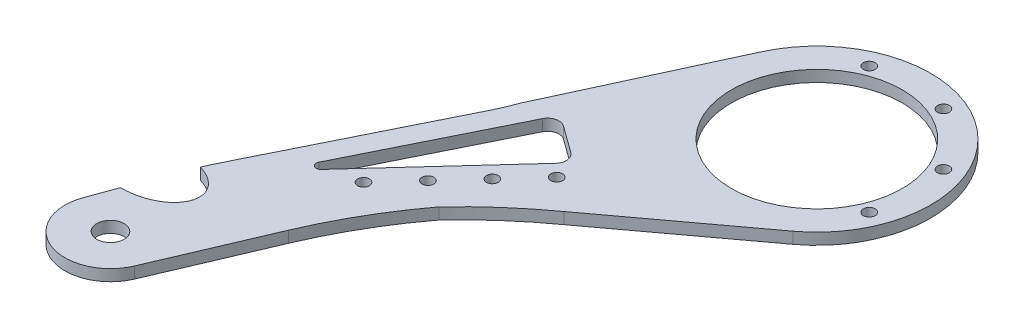
ISO-10303-21;
HEADER;
FILE_DESCRIPTION(('STEP AP214'),'2;1');
FILE_NAME('part.step','',(''),(''),'','','');
FILE_SCHEMA(('AUTOMOTIVE_DESIGN { 1 0 10303 214 1 1 1 1 }'));
ENDSEC;
DATA;
#1=APPLICATION_CONTEXT('core data for automotive mechanical design processes');
#2=APPLICATION_PROTOCOL_DEFINITION('international standard','automotive_design',2000,#1);
#3=PRODUCT_CONTEXT('',#1,'mechanical');
#4=PRODUCT('Part','Part','',(#3));
#5=PRODUCT_RELATED_PRODUCT_CATEGORY('part','',(#4));
#6=PRODUCT_DEFINITION_FORMATION('','',#4);
#7=PRODUCT_DEFINITION_CONTEXT('part definition',#1,'design');
#8=PRODUCT_DEFINITION('design','',#6,#7);
#9=PRODUCT_DEFINITION_SHAPE('','',#8);
#10=(LENGTH_UNIT() NAMED_UNIT(*) SI_UNIT(.MILLI.,.METRE.));
#11=(NAMED_UNIT(*) PLANE_ANGLE_UNIT() SI_UNIT($,.RADIAN.));
#12=(NAMED_UNIT(*) SI_UNIT($,.STERADIAN.) SOLID_ANGLE_UNIT());
#13=UNCERTAINTY_MEASURE_WITH_UNIT(LENGTH_MEASURE(1.E-05),#10,'distance_accuracy_value','');
#14=(GEOMETRIC_REPRESENTATION_CONTEXT(3) GLOBAL_UNCERTAINTY_ASSIGNED_CONTEXT((#13)) GLOBAL_UNIT_ASSIGNED_CONTEXT((#10,
#11,#12)) REPRESENTATION_CONTEXT('',''));
#15=CARTESIAN_POINT('',(0.,0.,0.));
#16=DIRECTION('',(0.,0.,1.));
#17=DIRECTION('',(1.,0.,0.));
#18=AXIS2_PLACEMENT_3D('',#15,#16,#17);
#19=CARTESIAN_POINT('',(-88.7927003386237,5.,81.1322056754742));
#20=DIRECTION('',(0.,1.,0.));
#21=DIRECTION('',(0.,0.,1.));
#22=AXIS2_PLACEMENT_3D('',#19,#20,#21);
#23=PLANE('',#22);
#24=CARTESIAN_POINT('',(27.9615833019237,5.,-116.100257823008));
#25=DIRECTION('',(0.,1.,0.));
#26=DIRECTION('',(0.,0.,1.));
#27=AXIS2_PLACEMENT_3D('',#24,#25,#26);
#28=CIRCLE('',#27,2.59999999999999);
#29=CARTESIAN_POINT('',(27.9615833019237,5.,-113.500257823008));
#30=VERTEX_POINT('',#29);
#31=EDGE_CURVE('E830',#30,#30,#28,.T.);
#32=ORIENTED_EDGE('',*,*,#31,.F.);
#33=EDGE_LOOP('',(#32));
#34=FACE_BOUND('',#33,.T.);
#35=CARTESIAN_POINT('',(83.4905093091692,5.,-60.5713318157631));
#36=DIRECTION('',(0.,1.,0.));
#37=DIRECTION('',(0.,0.,1.));
#38=AXIS2_PLACEMENT_3D('',#35,#36,#37);
#39=CIRCLE('',#38,2.59999999999989);
#40=CARTESIAN_POINT('',(83.4905093091692,5.,-57.9713318157632));
#41=VERTEX_POINT('',#40);
#42=EDGE_CURVE('E836',#41,#41,#39,.T.);
#43=ORIENTED_EDGE('',*,*,#42,.F.);
#44=EDGE_LOOP('',(#43));
#45=FACE_BOUND('',#44,.T.);
#46=CARTESIAN_POINT('',(83.4905093091702,5.,-93.0994235667966));
#47=DIRECTION('',(0.,1.,0.));
#48=DIRECTION('',(0.,0.,1.));
#49=AXIS2_PLACEMENT_3D('',#46,#47,#48);
#50=CIRCLE('',#49,2.60000000000001);
#51=CARTESIAN_POINT('',(83.4905093091702,5.,-90.4994235667966));
#52=VERTEX_POINT('',#51);
#53=EDGE_CURVE('E848',#52,#52,#50,.T.);
#54=ORIENTED_EDGE('',*,*,#53,.F.);
#55=EDGE_LOOP('',(#54));
#56=FACE_BOUND('',#55,.T.);
#57=CARTESIAN_POINT('',(60.4896750529558,5.,-116.100257823009));
#58=DIRECTION('',(0.,1.,0.));
#59=DIRECTION('',(0.,0.,1.));
#60=AXIS2_PLACEMENT_3D('',#57,#58,#59);
#61=CIRCLE('',#60,2.6);
#62=CARTESIAN_POINT('',(60.4896750529558,5.,-113.500257823009));
#63=VERTEX_POINT('',#62);
#64=EDGE_CURVE('E489',#63,#63,#61,.T.);
#65=ORIENTED_EDGE('',*,*,#64,.F.);
#66=EDGE_LOOP('',(#65));
#67=FACE_BOUND('',#66,.T.);
#68=CARTESIAN_POINT('',(-25.3201127019089,5.,24.2247027825062));
#69=DIRECTION('',(0.,1.,0.));
#70=DIRECTION('',(0.,0.,1.));
#71=AXIS2_PLACEMENT_3D('',#68,#69,#70);
#72=CIRCLE('',#71,2.6);
#73=CARTESIAN_POINT('',(-25.3201127019089,5.,26.8247027825062));
#74=VERTEX_POINT('',#73);
#75=EDGE_CURVE('E493',#74,#74,#72,.T.);
#76=ORIENTED_EDGE('',*,*,#75,.F.);
#77=EDGE_LOOP('',(#76));
#78=FACE_BOUND('',#77,.T.);
#79=CARTESIAN_POINT('',(-38.8046537707504,5.,38.9951852445901));
#80=DIRECTION('',(0.,1.,0.));
#81=DIRECTION('',(0.,0.,1.));
#82=AXIS2_PLACEMENT_3D('',#79,#80,#81);
#83=CIRCLE('',#82,2.6);
#84=CARTESIAN_POINT('',(-38.8046537707504,5.,41.5951852445901));
#85=VERTEX_POINT('',#84);
#86=EDGE_CURVE('E505',#85,#85,#83,.T.);
#87=ORIENTED_EDGE('',*,*,#86,.F.);
#88=EDGE_LOOP('',(#87));
#89=FACE_BOUND('',#88,.T.);
#90=CARTESIAN_POINT('',(-75.6532377558085,5.,113.15518022732));
#91=DIRECTION('',(0.,1.,0.));
#92=DIRECTION('',(0.,0.,1.));
#93=AXIS2_PLACEMENT_3D('',#90,#91,#92);
#94=CIRCLE('',#93,6.00000000000002);
#95=CARTESIAN_POINT('',(-75.6532377558085,5.,119.15518022732));
#96=VERTEX_POINT('',#95);
#97=EDGE_CURVE('E211',#96,#96,#94,.T.);
#98=ORIENTED_EDGE('',*,*,#97,.F.);
#99=EDGE_LOOP('',(#98));
#100=FACE_BOUND('',#99,.T.);
#101=CARTESIAN_POINT('',(44.2256291774395,5.,-76.8353776912794));
#102=DIRECTION('',(0.,1.,0.));
#103=DIRECTION('',(0.,0.,1.));
#104=AXIS2_PLACEMENT_3D('',#101,#102,#103);
#105=CIRCLE('',#104,50.);
#106=CARTESIAN_POINT('',(73.9920089972099,5.,-36.6612239052298));
#107=VERTEX_POINT('',#106);
#108=CARTESIAN_POINT('',(-1.18705120751491,5.,-97.7563829313242));
#109=VERTEX_POINT('',#108);
#110=EDGE_CURVE('E241',#107,#109,#105,.T.);
#111=ORIENTED_EDGE('',*,*,#110,.T.);
#112=DIRECTION('',(-0.418420104800895,0.,0.908253607699088));
#113=VECTOR('',#112,1.);
#114=CARTESIAN_POINT('',(-1.18705120751491,5.,-97.7563829313242));
#115=LINE('',#114,#113);
#116=CARTESIAN_POINT('',(-34.3999667324277,5.,-25.6619735050336));
#117=VERTEX_POINT('',#116);
#118=EDGE_CURVE('E245',#109,#117,#115,.T.);
#119=ORIENTED_EDGE('',*,*,#118,.T.);
#120=CARTESIAN_POINT('',(-128.369228811018,5.,-59.863987837601));
#121=DIRECTION('',(0.,-1.,0.));
#122=DIRECTION('',(0.,0.,1.));
#123=AXIS2_PLACEMENT_3D('',#120,#121,#122);
#124=CIRCLE('',#123,100.);
#125=CARTESIAN_POINT('',(-38.7551272658423,5.,-15.487047832111));
#126=VERTEX_POINT('',#125);
#127=EDGE_CURVE('E249',#117,#126,#124,.T.);
#128=ORIENTED_EDGE('',*,*,#127,.T.);
#129=DIRECTION('',(-0.443769400054901,0.,0.896141015451761));
#130=VECTOR('',#129,1.);
#131=CARTESIAN_POINT('',(-38.7551272658423,5.,-15.487047832111));
#132=LINE('',#131,#130);
#133=CARTESIAN_POINT('',(-76.7022391093313,5.,61.1427588573066));
#134=VERTEX_POINT('',#133);
#135=EDGE_CURVE('E252',#126,#134,#132,.T.);
#136=ORIENTED_EDGE('',*,*,#135,.T.);
#137=CARTESIAN_POINT('',(102.525963981021,5.,149.896638868287));
#138=DIRECTION('',(0.,1.,0.));
#139=DIRECTION('',(0.,0.,1.));
#140=AXIS2_PLACEMENT_3D('',#137,#138,#139);
#141=CIRCLE('',#140,200.);
#142=CARTESIAN_POINT('',(-80.375519882012,5.,68.9828130985166));
#143=VERTEX_POINT('',#142);
#144=EDGE_CURVE('E255',#134,#143,#141,.T.);
#145=ORIENTED_EDGE('',*,*,#144,.T.);
#146=CARTESIAN_POINT('',(-88.7927003386237,5.,81.1322056754742));
#147=DIRECTION('',(0.,-1.,0.));
#148=DIRECTION('',(0.998564288915161,0.,-0.0535664158158636));
#149=AXIS2_PLACEMENT_3D('',#146,#147,#148);
#150=ELLIPSE('',#149,19.6254544070607,13.1666159932936);
#151=CARTESIAN_POINT('',(-90.0808788848002,5.,94.3187104419573));
#152=VERTEX_POINT('',#151);
#153=EDGE_CURVE('E258',#143,#152,#150,.T.);
#154=ORIENTED_EDGE('',*,*,#153,.T.);
#155=DIRECTION('',(-0.342020143325669,0.,0.939692620785908));
#156=VECTOR('',#155,1.);
#157=CARTESIAN_POINT('',(-90.0808788848002,5.,94.3187104419573));
#158=LINE('',#157,#156);
#159=CARTESIAN_POINT('',(-94.4470901715267,5.,106.314777360806));
#160=VERTEX_POINT('',#159);
#161=EDGE_CURVE('E262',#152,#160,#158,.T.);
#162=ORIENTED_EDGE('',*,*,#161,.T.);
#163=CARTESIAN_POINT('',(-75.6532377558085,5.,113.15518022732));
#164=DIRECTION('',(0.,1.,0.));
#165=DIRECTION('',(0.,0.,1.));
#166=AXIS2_PLACEMENT_3D('',#163,#164,#165);
#167=CIRCLE('',#166,20.0000000000001);
#168=CARTESIAN_POINT('',(-57.2522995441009,5.,120.991344654444));
#169=VERTEX_POINT('',#168);
#170=EDGE_CURVE('E447',#160,#169,#167,.T.);
#171=ORIENTED_EDGE('',*,*,#170,.T.);
#172=DIRECTION('',(0.391808221356202,0.,-0.920046910585373));
#173=VECTOR('',#172,1.);
#174=CARTESIAN_POINT('',(-57.2522995441009,5.,120.991344654444));
#175=LINE('',#174,#173);
#176=CARTESIAN_POINT('',(-37.0734908065259,5.,73.6073194442618));
#177=VERTEX_POINT('',#176);
#178=EDGE_CURVE('E345',#169,#177,#175,.T.);
#179=ORIENTED_EDGE('',*,*,#178,.T.);
#180=CARTESIAN_POINT('',(146.935891310549,5.,151.968963715502));
#181=DIRECTION('',(0.,-1.,0.));
#182=DIRECTION('',(0.,0.,1.));
#183=AXIS2_PLACEMENT_3D('',#180,#181,#182);
#184=CIRCLE('',#183,200.);
#185=CARTESIAN_POINT('',(-12.947104360705,5.,31.8131161874443));
#186=VERTEX_POINT('',#185);
#187=EDGE_CURVE('E443',#177,#186,#184,.T.);
#188=ORIENTED_EDGE('',*,*,#187,.T.);
#189=CARTESIAN_POINT('',(133.146696692921,5.,168.402285940041));
#190=DIRECTION('',(0.,-1.,0.));
#191=DIRECTION('',(0.,0.,1.));
#192=AXIS2_PLACEMENT_3D('',#189,#190,#191);
#193=CIRCLE('',#192,200.);
#194=CARTESIAN_POINT('',(16.2791838018403,5.,6.10014661140118));
#195=VERTEX_POINT('',#194);
#196=EDGE_CURVE('E440',#186,#195,#193,.T.);
#197=ORIENTED_EDGE('',*,*,#196,.T.);
#198=DIRECTION('',(0.803483075720993,0.,-0.595327596395407));
#199=VECTOR('',#198,1.);
#200=CARTESIAN_POINT('',(16.2791838018403,5.,6.1001466114012));
#201=LINE('',#200,#199);
#202=EDGE_CURVE('E370',#195,#107,#201,.T.);
#203=ORIENTED_EDGE('',*,*,#202,.T.);
#204=EDGE_LOOP('',(#111,#119,#128,#136,#145,#154,#162,#171,#179,#188,#197,#203));
#205=FACE_BOUND('',#204,.T.);
#206=DIRECTION('',(0.674227053442074,0.,-0.738524123104194));
#207=VECTOR('',#206,1.);
#208=CARTESIAN_POINT('',(-52.9804236740807,5.,43.3989658731272));
#209=LINE('',#208,#207);
#210=CARTESIAN_POINT('',(-52.9804236740807,5.,43.3989658731272));
#211=VERTEX_POINT('',#210);
#212=CARTESIAN_POINT('',(-3.88996148750742,5.,-10.3729650424772));
#213=VERTEX_POINT('',#212);
#214=EDGE_CURVE('E178',#211,#213,#209,.T.);
#215=ORIENTED_EDGE('',*,*,#214,.F.);
#216=CARTESIAN_POINT('',(-54.4574719202891,5.,42.0505117662431));
#217=DIRECTION('',(0.,1.,0.));
#218=DIRECTION('',(0.,0.,1.));
#219=AXIS2_PLACEMENT_3D('',#216,#217,#218);
#220=CIRCLE('',#219,2.);
#221=CARTESIAN_POINT('',(-56.2497539511927,5.,41.1629729661333));
#222=VERTEX_POINT('',#221);
#223=EDGE_CURVE('E169',#222,#211,#220,.T.);
#224=ORIENTED_EDGE('',*,*,#223,.F.);
#225=DIRECTION('',(-0.443769400054901,0.,0.896141015451761));
#226=VECTOR('',#225,1.);
#227=CARTESIAN_POINT('',(-23.7609108853903,5.,-24.4444907576818));
#228=LINE('',#227,#226);
#229=CARTESIAN_POINT('',(-23.7609108853902,5.,-24.4444907576818));
#230=VERTEX_POINT('',#229);
#231=EDGE_CURVE('E206',#230,#222,#228,.T.);
#232=ORIENTED_EDGE('',*,*,#231,.F.);
#233=CARTESIAN_POINT('',(-19.2802058081314,5.,-22.2256437574073));
#234=DIRECTION('',(0.,1.,0.));
#235=DIRECTION('',(0.,0.,1.));
#236=AXIS2_PLACEMENT_3D('',#233,#234,#235);
#237=CIRCLE('',#236,5.00000000000001);
#238=CARTESIAN_POINT('',(-16.345194147774,5.,-26.2735699614735));
#239=VERTEX_POINT('',#238);
#240=EDGE_CURVE('E203',#239,#230,#237,.T.);
#241=ORIENTED_EDGE('',*,*,#240,.F.);
#242=DIRECTION('',(-0.809585240813242,0.,-0.587002332071488));
#243=VECTOR('',#242,1.);
#244=CARTESIAN_POINT('',(-4.64757044267095,5.,-17.7920265137537));
#245=LINE('',#244,#243);
#246=CARTESIAN_POINT('',(-4.64757044267095,5.,-17.7920265137537));
#247=VERTEX_POINT('',#246);
#248=EDGE_CURVE('E197',#247,#239,#245,.T.);
#249=ORIENTED_EDGE('',*,*,#248,.F.);
#250=CARTESIAN_POINT('',(-7.58258210302839,5.,-13.7441003096875));
#251=DIRECTION('',(0.,1.,0.));
#252=DIRECTION('',(0.,0.,1.));
#253=AXIS2_PLACEMENT_3D('',#250,#251,#252);
#254=CIRCLE('',#253,5.);
#255=EDGE_CURVE('E193',#213,#247,#254,.T.);
#256=ORIENTED_EDGE('',*,*,#255,.F.);
#257=EDGE_LOOP('',(#215,#224,#232,#241,#249,#256));
#258=FACE_BOUND('',#257,.T.);
#259=CARTESIAN_POINT('',(44.2256291774395,5.,-76.8353776912794));
#260=DIRECTION('',(0.,1.,0.));
#261=DIRECTION('',(0.,0.,1.));
#262=AXIS2_PLACEMENT_3D('',#259,#260,#261);
#263=CIRCLE('',#262,37.5);
#264=CARTESIAN_POINT('',(44.2256291774395,5.,-39.3353776912794));
#265=VERTEX_POINT('',#264);
#266=EDGE_CURVE('E511',#265,#265,#263,.T.);
#267=ORIENTED_EDGE('',*,*,#266,.F.);
#268=EDGE_LOOP('',(#267));
#269=FACE_BOUND('',#268,.T.);
#270=CARTESIAN_POINT('',(-11.8355716330674,5.,9.45422032042229));
#271=DIRECTION('',(0.,1.,0.));
#272=DIRECTION('',(0.,0.,1.));
#273=AXIS2_PLACEMENT_3D('',#270,#271,#272);
#274=CIRCLE('',#273,2.6);
#275=CARTESIAN_POINT('',(-11.8355716330674,5.,12.0542203204223));
#276=VERTEX_POINT('',#275);
#277=EDGE_CURVE('E499',#276,#276,#274,.T.);
#278=ORIENTED_EDGE('',*,*,#277,.F.);
#279=EDGE_LOOP('',(#278));
#280=FACE_BOUND('',#279,.T.);
#281=CARTESIAN_POINT('',(1.64896943577402,5.,-5.3162621416616));
#282=DIRECTION('',(0.,1.,0.));
#283=DIRECTION('',(0.,0.,1.));
#284=AXIS2_PLACEMENT_3D('',#281,#282,#283);
#285=CIRCLE('',#284,2.6);
#286=CARTESIAN_POINT('',(1.64896943577402,5.,-2.7162621416616));
#287=VERTEX_POINT('',#286);
#288=EDGE_CURVE('E481',#287,#287,#285,.T.);
#289=ORIENTED_EDGE('',*,*,#288,.F.);
#290=EDGE_LOOP('',(#289));
#291=FACE_BOUND('',#290,.T.);
#292=ADVANCED_FACE('F43',(#34,#45,#56,#67,#78,#89,#100,#205,#258,#269,#280,#291),#23,.T.);
#293=CARTESIAN_POINT('',(-88.7927003386237,0.,81.1322056754742));
#294=DIRECTION('',(0.,1.,0.));
#295=DIRECTION('',(0.,0.,1.));
#296=AXIS2_PLACEMENT_3D('',#293,#294,#295);
#297=PLANE('',#296);
#298=CARTESIAN_POINT('',(27.9615833019237,0.,-116.100257823008));
#299=DIRECTION('',(0.,1.,0.));
#300=DIRECTION('',(0.,0.,1.));
#301=AXIS2_PLACEMENT_3D('',#298,#299,#300);
#302=CIRCLE('',#301,2.59999999999999);
#303=CARTESIAN_POINT('',(27.9615833019237,0.,-113.500257823008));
#304=VERTEX_POINT('',#303);
#305=EDGE_CURVE('E828',#304,#304,#302,.T.);
#306=ORIENTED_EDGE('',*,*,#305,.T.);
#307=EDGE_LOOP('',(#306));
#308=FACE_BOUND('',#307,.T.);
#309=CARTESIAN_POINT('',(83.4905093091692,0.,-60.5713318157631));
#310=DIRECTION('',(0.,1.,0.));
#311=DIRECTION('',(0.,0.,1.));
#312=AXIS2_PLACEMENT_3D('',#309,#310,#311);
#313=CIRCLE('',#312,2.59999999999989);
#314=CARTESIAN_POINT('',(83.4905093091692,0.,-57.9713318157632));
#315=VERTEX_POINT('',#314);
#316=EDGE_CURVE('E845',#315,#315,#313,.T.);
#317=ORIENTED_EDGE('',*,*,#316,.T.);
#318=EDGE_LOOP('',(#317));
#319=FACE_BOUND('',#318,.T.);
#320=CARTESIAN_POINT('',(83.4905093091702,0.,-93.0994235667966));
#321=DIRECTION('',(0.,1.,0.));
#322=DIRECTION('',(0.,0.,1.));
#323=AXIS2_PLACEMENT_3D('',#320,#321,#322);
#324=CIRCLE('',#323,2.60000000000001);
#325=CARTESIAN_POINT('',(83.4905093091702,0.,-90.4994235667966));
#326=VERTEX_POINT('',#325);
#327=EDGE_CURVE('E839',#326,#326,#324,.T.);
#328=ORIENTED_EDGE('',*,*,#327,.T.);
#329=EDGE_LOOP('',(#328));
#330=FACE_BOUND('',#329,.T.);
#331=CARTESIAN_POINT('',(60.4896750529558,0.,-116.100257823009));
#332=DIRECTION('',(0.,1.,0.));
#333=DIRECTION('',(0.,0.,1.));
#334=AXIS2_PLACEMENT_3D('',#331,#332,#333);
#335=CIRCLE('',#334,2.6);
#336=CARTESIAN_POINT('',(60.4896750529558,0.,-113.500257823009));
#337=VERTEX_POINT('',#336);
#338=EDGE_CURVE('E482',#337,#337,#335,.T.);
#339=ORIENTED_EDGE('',*,*,#338,.T.);
#340=EDGE_LOOP('',(#339));
#341=FACE_BOUND('',#340,.T.);
#342=CARTESIAN_POINT('',(44.2256291774395,0.,-76.8353776912794));
#343=DIRECTION('',(0.,1.,0.));
#344=DIRECTION('',(0.,0.,1.));
#345=AXIS2_PLACEMENT_3D('',#342,#343,#344);
#346=CIRCLE('',#345,50.);
#347=CARTESIAN_POINT('',(73.9920089972099,0.,-36.6612239052298));
#348=VERTEX_POINT('',#347);
#349=CARTESIAN_POINT('',(-1.18705120751491,0.,-97.7563829313242));
#350=VERTEX_POINT('',#349);
#351=EDGE_CURVE('E187',#348,#350,#346,.T.);
#352=ORIENTED_EDGE('',*,*,#351,.F.);
#353=DIRECTION('',(0.803483075720993,0.,-0.595327596395407));
#354=VECTOR('',#353,1.);
#355=CARTESIAN_POINT('',(16.2791838018403,0.,6.1001466114012));
#356=LINE('',#355,#354);
#357=CARTESIAN_POINT('',(16.2791838018403,0.,6.10014661140118));
#358=VERTEX_POINT('',#357);
#359=EDGE_CURVE('E246',#358,#348,#356,.T.);
#360=ORIENTED_EDGE('',*,*,#359,.F.);
#361=CARTESIAN_POINT('',(133.146696692921,0.,168.402285940041));
#362=DIRECTION('',(0.,-1.,0.));
#363=DIRECTION('',(0.,0.,1.));
#364=AXIS2_PLACEMENT_3D('',#361,#362,#363);
#365=CIRCLE('',#364,200.);
#366=CARTESIAN_POINT('',(-12.947104360705,0.,31.8131161874443));
#367=VERTEX_POINT('',#366);
#368=EDGE_CURVE('E357',#367,#358,#365,.T.);
#369=ORIENTED_EDGE('',*,*,#368,.F.);
#370=CARTESIAN_POINT('',(146.935891310549,0.,151.968963715502));
#371=DIRECTION('',(0.,-1.,0.));
#372=DIRECTION('',(0.,0.,1.));
#373=AXIS2_PLACEMENT_3D('',#370,#371,#372);
#374=CIRCLE('',#373,200.);
#375=CARTESIAN_POINT('',(-37.0734908065259,0.,73.6073194442618));
#376=VERTEX_POINT('',#375);
#377=EDGE_CURVE('E353',#376,#367,#374,.T.);
#378=ORIENTED_EDGE('',*,*,#377,.F.);
#379=DIRECTION('',(0.391808221356202,0.,-0.920046910585373));
#380=VECTOR('',#379,1.);
#381=CARTESIAN_POINT('',(-57.2522995441009,0.,120.991344654444));
#382=LINE('',#381,#380);
#383=CARTESIAN_POINT('',(-57.2522995441009,0.,120.991344654444));
#384=VERTEX_POINT('',#383);
#385=EDGE_CURVE('E340',#384,#376,#382,.T.);
#386=ORIENTED_EDGE('',*,*,#385,.F.);
#387=CARTESIAN_POINT('',(-75.6532377558085,0.,113.15518022732));
#388=DIRECTION('',(0.,1.,0.));
#389=DIRECTION('',(0.,0.,1.));
#390=AXIS2_PLACEMENT_3D('',#387,#388,#389);
#391=CIRCLE('',#390,20.0000000000001);
#392=CARTESIAN_POINT('',(-94.4470901715267,0.,106.314777360806));
#393=VERTEX_POINT('',#392);
#394=EDGE_CURVE('E329',#393,#384,#391,.T.);
#395=ORIENTED_EDGE('',*,*,#394,.F.);
#396=DIRECTION('',(-0.342020143325669,0.,0.939692620785908));
#397=VECTOR('',#396,1.);
#398=CARTESIAN_POINT('',(-90.0808788848002,0.,94.3187104419573));
#399=LINE('',#398,#397);
#400=CARTESIAN_POINT('',(-90.0808788848002,0.,94.3187104419573));
#401=VERTEX_POINT('',#400);
#402=EDGE_CURVE('E341',#401,#393,#399,.T.);
#403=ORIENTED_EDGE('',*,*,#402,.F.);
#404=CARTESIAN_POINT('',(-88.7927003386237,0.,81.1322056754742));
#405=DIRECTION('',(0.,-1.,0.));
#406=DIRECTION('',(0.998564288915161,0.,-0.0535664158158636));
#407=AXIS2_PLACEMENT_3D('',#404,#405,#406);
#408=ELLIPSE('',#407,19.6254544070607,13.1666159932936);
#409=CARTESIAN_POINT('',(-80.375519882012,0.,68.9828130985166));
#410=VERTEX_POINT('',#409);
#411=EDGE_CURVE('E419',#410,#401,#408,.T.);
#412=ORIENTED_EDGE('',*,*,#411,.F.);
#413=CARTESIAN_POINT('',(102.525963981021,0.,149.896638868287));
#414=DIRECTION('',(0.,1.,0.));
#415=DIRECTION('',(0.,0.,1.));
#416=AXIS2_PLACEMENT_3D('',#413,#414,#415);
#417=CIRCLE('',#416,200.);
#418=CARTESIAN_POINT('',(-76.7022391093313,0.,61.1427588573066));
#419=VERTEX_POINT('',#418);
#420=EDGE_CURVE('E412',#419,#410,#417,.T.);
#421=ORIENTED_EDGE('',*,*,#420,.F.);
#422=DIRECTION('',(-0.443769400054901,0.,0.896141015451761));
#423=VECTOR('',#422,1.);
#424=CARTESIAN_POINT('',(-38.7551272658423,0.,-15.487047832111));
#425=LINE('',#424,#423);
#426=CARTESIAN_POINT('',(-38.7551272658423,0.,-15.487047832111));
#427=VERTEX_POINT('',#426);
#428=EDGE_CURVE('E407',#427,#419,#425,.T.);
#429=ORIENTED_EDGE('',*,*,#428,.F.);
#430=CARTESIAN_POINT('',(-128.369228811018,0.,-59.863987837601));
#431=DIRECTION('',(0.,-1.,0.));
#432=DIRECTION('',(0.,0.,1.));
#433=AXIS2_PLACEMENT_3D('',#430,#431,#432);
#434=CIRCLE('',#433,100.);
#435=CARTESIAN_POINT('',(-34.3999667324277,0.,-25.6619735050336));
#436=VERTEX_POINT('',#435);
#437=EDGE_CURVE('E403',#436,#427,#434,.T.);
#438=ORIENTED_EDGE('',*,*,#437,.F.);
#439=DIRECTION('',(-0.418420104800895,0.,0.908253607699088));
#440=VECTOR('',#439,1.);
#441=CARTESIAN_POINT('',(-1.18705120751491,0.,-97.7563829313242));
#442=LINE('',#441,#440);
#443=EDGE_CURVE('E405',#350,#436,#442,.T.);
#444=ORIENTED_EDGE('',*,*,#443,.F.);
#445=EDGE_LOOP('',(#352,#360,#369,#378,#386,#395,#403,#412,#421,#429,#438,#444));
#446=FACE_BOUND('',#445,.T.);
#447=CARTESIAN_POINT('',(-54.4574719202891,0.,42.0505117662431));
#448=DIRECTION('',(0.,1.,0.));
#449=DIRECTION('',(0.,0.,1.));
#450=AXIS2_PLACEMENT_3D('',#447,#448,#449);
#451=CIRCLE('',#450,2.);
#452=CARTESIAN_POINT('',(-56.2497539511927,0.,41.1629729661333));
#453=VERTEX_POINT('',#452);
#454=CARTESIAN_POINT('',(-52.9804236740807,0.,43.3989658731272));
#455=VERTEX_POINT('',#454);
#456=EDGE_CURVE('E67',#453,#455,#451,.T.);
#457=ORIENTED_EDGE('',*,*,#456,.T.);
#458=DIRECTION('',(0.674227053442074,0.,-0.738524123104194));
#459=VECTOR('',#458,1.);
#460=CARTESIAN_POINT('',(-52.9804236740807,0.,43.3989658731272));
#461=LINE('',#460,#459);
#462=CARTESIAN_POINT('',(-3.88996148750742,0.,-10.3729650424772));
#463=VERTEX_POINT('',#462);
#464=EDGE_CURVE('E185',#455,#463,#461,.T.);
#465=ORIENTED_EDGE('',*,*,#464,.T.);
#466=CARTESIAN_POINT('',(-7.58258210302839,0.,-13.7441003096875));
#467=DIRECTION('',(0.,1.,0.));
#468=DIRECTION('',(0.,0.,1.));
#469=AXIS2_PLACEMENT_3D('',#466,#467,#468);
#470=CIRCLE('',#469,5.);
#471=CARTESIAN_POINT('',(-4.64757044267095,0.,-17.7920265137537));
#472=VERTEX_POINT('',#471);
#473=EDGE_CURVE('E214',#463,#472,#470,.T.);
#474=ORIENTED_EDGE('',*,*,#473,.T.);
#475=DIRECTION('',(-0.809585240813242,0.,-0.587002332071488));
#476=VECTOR('',#475,1.);
#477=CARTESIAN_POINT('',(-4.64757044267095,0.,-17.7920265137537));
#478=LINE('',#477,#476);
#479=CARTESIAN_POINT('',(-16.345194147774,0.,-26.2735699614735));
#480=VERTEX_POINT('',#479);
#481=EDGE_CURVE('E218',#472,#480,#478,.T.);
#482=ORIENTED_EDGE('',*,*,#481,.T.);
#483=CARTESIAN_POINT('',(-19.2802058081314,0.,-22.2256437574073));
#484=DIRECTION('',(0.,1.,0.));
#485=DIRECTION('',(0.,0.,1.));
#486=AXIS2_PLACEMENT_3D('',#483,#484,#485);
#487=CIRCLE('',#486,5.00000000000001);
#488=CARTESIAN_POINT('',(-23.7609108853903,0.,-24.4444907576818));
#489=VERTEX_POINT('',#488);
#490=EDGE_CURVE('E222',#480,#489,#487,.T.);
#491=ORIENTED_EDGE('',*,*,#490,.T.);
#492=DIRECTION('',(-0.443769400054901,0.,0.896141015451761));
#493=VECTOR('',#492,1.);
#494=CARTESIAN_POINT('',(-23.7609108853903,0.,-24.4444907576818));
#495=LINE('',#494,#493);
#496=EDGE_CURVE('E179',#489,#453,#495,.T.);
#497=ORIENTED_EDGE('',*,*,#496,.T.);
#498=EDGE_LOOP('',(#457,#465,#474,#482,#491,#497));
#499=FACE_BOUND('',#498,.T.);
#500=CARTESIAN_POINT('',(-75.6532377558085,0.,113.15518022732));
#501=DIRECTION('',(0.,1.,0.));
#502=DIRECTION('',(0.,0.,1.));
#503=AXIS2_PLACEMENT_3D('',#500,#501,#502);
#504=CIRCLE('',#503,6.00000000000002);
#505=CARTESIAN_POINT('',(-75.6532377558085,0.,119.15518022732));
#506=VERTEX_POINT('',#505);
#507=EDGE_CURVE('E459',#506,#506,#504,.T.);
#508=ORIENTED_EDGE('',*,*,#507,.T.);
#509=EDGE_LOOP('',(#508));
#510=FACE_BOUND('',#509,.T.);
#511=CARTESIAN_POINT('',(44.2256291774395,0.,-76.8353776912794));
#512=DIRECTION('',(0.,1.,0.));
#513=DIRECTION('',(0.,0.,1.));
#514=AXIS2_PLACEMENT_3D('',#511,#512,#513);
#515=CIRCLE('',#514,37.5);
#516=CARTESIAN_POINT('',(44.2256291774395,0.,-39.3353776912794));
#517=VERTEX_POINT('',#516);
#518=EDGE_CURVE('E463',#517,#517,#515,.T.);
#519=ORIENTED_EDGE('',*,*,#518,.T.);
#520=EDGE_LOOP('',(#519));
#521=FACE_BOUND('',#520,.T.);
#522=CARTESIAN_POINT('',(-38.8046537707504,0.,38.9951852445901));
#523=DIRECTION('',(0.,1.,0.));
#524=DIRECTION('',(0.,0.,1.));
#525=AXIS2_PLACEMENT_3D('',#522,#523,#524);
#526=CIRCLE('',#525,2.6);
#527=CARTESIAN_POINT('',(-38.8046537707504,0.,41.5951852445901));
#528=VERTEX_POINT('',#527);
#529=EDGE_CURVE('E467',#528,#528,#526,.T.);
#530=ORIENTED_EDGE('',*,*,#529,.T.);
#531=EDGE_LOOP('',(#530));
#532=FACE_BOUND('',#531,.T.);
#533=CARTESIAN_POINT('',(-11.8355716330674,0.,9.45422032042229));
#534=DIRECTION('',(0.,1.,0.));
#535=DIRECTION('',(0.,0.,1.));
#536=AXIS2_PLACEMENT_3D('',#533,#534,#535);
#537=CIRCLE('',#536,2.6);
#538=CARTESIAN_POINT('',(-11.8355716330674,0.,12.0542203204223));
#539=VERTEX_POINT('',#538);
#540=EDGE_CURVE('E471',#539,#539,#537,.T.);
#541=ORIENTED_EDGE('',*,*,#540,.T.);
#542=EDGE_LOOP('',(#541));
#543=FACE_BOUND('',#542,.T.);
#544=CARTESIAN_POINT('',(-25.3201127019089,0.,24.2247027825062));
#545=DIRECTION('',(0.,1.,0.));
#546=DIRECTION('',(0.,0.,1.));
#547=AXIS2_PLACEMENT_3D('',#544,#545,#546);
#548=CIRCLE('',#547,2.6);
#549=CARTESIAN_POINT('',(-25.3201127019089,0.,26.8247027825062));
#550=VERTEX_POINT('',#549);
#551=EDGE_CURVE('E475',#550,#550,#548,.T.);
#552=ORIENTED_EDGE('',*,*,#551,.T.);
#553=EDGE_LOOP('',(#552));
#554=FACE_BOUND('',#553,.T.);
#555=CARTESIAN_POINT('',(1.64896943577402,0.,-5.3162621416616));
#556=DIRECTION('',(0.,1.,0.));
#557=DIRECTION('',(0.,0.,1.));
#558=AXIS2_PLACEMENT_3D('',#555,#556,#557);
#559=CIRCLE('',#558,2.6);
#560=CARTESIAN_POINT('',(1.64896943577402,0.,-2.7162621416616));
#561=VERTEX_POINT('',#560);
#562=EDGE_CURVE('E478',#561,#561,#559,.T.);
#563=ORIENTED_EDGE('',*,*,#562,.T.);
#564=EDGE_LOOP('',(#563));
#565=FACE_BOUND('',#564,.T.);
#566=ADVANCED_FACE('F289',(#308,#319,#330,#341,#446,#499,#510,#521,#532,#543,#554,#565),#297,.F.);
#567=CARTESIAN_POINT('',(44.2256291774395,5.,-76.8353776912794));
#568=DIRECTION('',(0.,-1.,0.));
#569=DIRECTION('',(0.,0.,-1.));
#570=AXIS2_PLACEMENT_3D('',#567,#568,#569);
#571=CYLINDRICAL_SURFACE('',#570,50.);
#572=ORIENTED_EDGE('',*,*,#351,.T.);
#573=DIRECTION('',(0.,-1.,0.));
#574=VECTOR('',#573,1.);
#575=CARTESIAN_POINT('',(-1.18705120751491,5.,-97.7563829313242));
#576=LINE('',#575,#574);
#577=EDGE_CURVE('E11',#109,#350,#576,.T.);
#578=ORIENTED_EDGE('',*,*,#577,.F.);
#579=ORIENTED_EDGE('',*,*,#110,.F.);
#580=DIRECTION('',(0.,-1.,0.));
#581=VECTOR('',#580,1.);
#582=CARTESIAN_POINT('',(73.9920089972099,5.,-36.6612239052298));
#583=LINE('',#582,#581);
#584=EDGE_CURVE('E365',#107,#348,#583,.T.);
#585=ORIENTED_EDGE('',*,*,#584,.T.);
#586=EDGE_LOOP('',(#572,#578,#579,#585));
#587=FACE_BOUND('',#586,.T.);
#588=ADVANCED_FACE('F45',(#587),#571,.T.);
#589=CARTESIAN_POINT('',(-1.18705120751491,5.,-97.7563829313242));
#590=DIRECTION('',(0.908253607699088,0.,0.418420104800895));
#591=DIRECTION('',(0.418420104800895,0.,-0.908253607699088));
#592=AXIS2_PLACEMENT_3D('',#589,#590,#591);
#593=PLANE('',#592);
#594=ORIENTED_EDGE('',*,*,#443,.T.);
#595=DIRECTION('',(0.,-1.,0.));
#596=VECTOR('',#595,1.);
#597=CARTESIAN_POINT('',(-34.3999667324277,5.,-25.6619735050336));
#598=LINE('',#597,#596);
#599=EDGE_CURVE('E52',#117,#436,#598,.T.);
#600=ORIENTED_EDGE('',*,*,#599,.F.);
#601=ORIENTED_EDGE('',*,*,#118,.F.);
#602=ORIENTED_EDGE('',*,*,#577,.T.);
#603=EDGE_LOOP('',(#594,#600,#601,#602));
#604=FACE_BOUND('',#603,.T.);
#605=ADVANCED_FACE('F282',(#604),#593,.F.);
#606=CARTESIAN_POINT('',(-128.369228811018,5.,-59.863987837601));
#607=DIRECTION('',(0.,-1.,0.));
#608=DIRECTION('',(0.,0.,-1.));
#609=AXIS2_PLACEMENT_3D('',#606,#607,#608);
#610=CYLINDRICAL_SURFACE('',#609,100.);
#611=ORIENTED_EDGE('',*,*,#437,.T.);
#612=DIRECTION('',(0.,-1.,0.));
#613=VECTOR('',#612,1.);
#614=CARTESIAN_POINT('',(-38.7551272658423,5.,-15.487047832111));
#615=LINE('',#614,#613);
#616=EDGE_CURVE('E394',#126,#427,#615,.T.);
#617=ORIENTED_EDGE('',*,*,#616,.F.);
#618=ORIENTED_EDGE('',*,*,#127,.F.);
#619=ORIENTED_EDGE('',*,*,#599,.T.);
#620=EDGE_LOOP('',(#611,#617,#618,#619));
#621=FACE_BOUND('',#620,.T.);
#622=ADVANCED_FACE('F279',(#621),#610,.F.);
#623=CARTESIAN_POINT('',(-38.7551272658423,5.,-15.487047832111));
#624=DIRECTION('',(0.896141015451761,0.,0.443769400054901));
#625=DIRECTION('',(0.443769400054901,0.,-0.896141015451761));
#626=AXIS2_PLACEMENT_3D('',#623,#624,#625);
#627=PLANE('',#626);
#628=ORIENTED_EDGE('',*,*,#428,.T.);
#629=DIRECTION('',(0.,-1.,0.));
#630=VECTOR('',#629,1.);
#631=CARTESIAN_POINT('',(-76.7022391093313,5.,61.1427588573066));
#632=LINE('',#631,#630);
#633=EDGE_CURVE('E390',#134,#419,#632,.T.);
#634=ORIENTED_EDGE('',*,*,#633,.F.);
#635=ORIENTED_EDGE('',*,*,#135,.F.);
#636=ORIENTED_EDGE('',*,*,#616,.T.);
#637=EDGE_LOOP('',(#628,#634,#635,#636));
#638=FACE_BOUND('',#637,.T.);
#639=ADVANCED_FACE('F275',(#638),#627,.F.);
#640=CARTESIAN_POINT('',(102.525963981021,5.,149.896638868287));
#641=DIRECTION('',(0.,-1.,0.));
#642=DIRECTION('',(0.,0.,-1.));
#643=AXIS2_PLACEMENT_3D('',#640,#641,#642);
#644=CYLINDRICAL_SURFACE('',#643,200.);
#645=ORIENTED_EDGE('',*,*,#420,.T.);
#646=DIRECTION('',(0.,-1.,0.));
#647=VECTOR('',#646,1.);
#648=CARTESIAN_POINT('',(-80.375519882012,5.,68.9828130985166));
#649=LINE('',#648,#647);
#650=EDGE_CURVE('E386',#143,#410,#649,.T.);
#651=ORIENTED_EDGE('',*,*,#650,.F.);
#652=ORIENTED_EDGE('',*,*,#144,.F.);
#653=ORIENTED_EDGE('',*,*,#633,.T.);
#654=EDGE_LOOP('',(#645,#651,#652,#653));
#655=FACE_BOUND('',#654,.T.);
#656=ADVANCED_FACE('F270',(#655),#644,.T.);
#657=DIRECTION('',(0.,-1.,0.));
#658=VECTOR('',#657,1.);
#659=SURFACE_OF_LINEAR_EXTRUSION('',#150,#658);
#660=ORIENTED_EDGE('',*,*,#411,.T.);
#661=DIRECTION('',(0.,-1.,0.));
#662=VECTOR('',#661,1.);
#663=CARTESIAN_POINT('',(-90.0808788848002,5.,94.3187104419573));
#664=LINE('',#663,#662);
#665=EDGE_CURVE('E382',#152,#401,#664,.T.);
#666=ORIENTED_EDGE('',*,*,#665,.F.);
#667=ORIENTED_EDGE('',*,*,#153,.F.);
#668=ORIENTED_EDGE('',*,*,#650,.T.);
#669=EDGE_LOOP('',(#660,#666,#667,#668));
#670=FACE_BOUND('',#669,.T.);
#671=ADVANCED_FACE('F265',(#670),#659,.F.);
#672=CARTESIAN_POINT('',(-90.0808788848002,5.,94.3187104419573));
#673=DIRECTION('',(0.939692620785908,0.,0.342020143325669));
#674=DIRECTION('',(0.342020143325669,0.,-0.939692620785908));
#675=AXIS2_PLACEMENT_3D('',#672,#673,#674);
#676=PLANE('',#675);
#677=ORIENTED_EDGE('',*,*,#402,.T.);
#678=DIRECTION('',(0.,-1.,0.));
#679=VECTOR('',#678,1.);
#680=CARTESIAN_POINT('',(-94.4470901715267,5.,106.314777360806));
#681=LINE('',#680,#679);
#682=EDGE_CURVE('E335',#160,#393,#681,.T.);
#683=ORIENTED_EDGE('',*,*,#682,.F.);
#684=ORIENTED_EDGE('',*,*,#161,.F.);
#685=ORIENTED_EDGE('',*,*,#665,.T.);
#686=EDGE_LOOP('',(#677,#683,#684,#685));
#687=FACE_BOUND('',#686,.T.);
#688=ADVANCED_FACE('F269',(#687),#676,.F.);
#689=CARTESIAN_POINT('',(-75.6532377558085,5.,113.15518022732));
#690=DIRECTION('',(0.,-1.,0.));
#691=DIRECTION('',(0.,0.,-1.));
#692=AXIS2_PLACEMENT_3D('',#689,#690,#691);
#693=CYLINDRICAL_SURFACE('',#692,20.0000000000001);
#694=ORIENTED_EDGE('',*,*,#394,.T.);
#695=DIRECTION('',(0.,-1.,0.));
#696=VECTOR('',#695,1.);
#697=CARTESIAN_POINT('',(-57.2522995441009,5.,120.991344654444));
#698=LINE('',#697,#696);
#699=EDGE_CURVE('E332',#169,#384,#698,.T.);
#700=ORIENTED_EDGE('',*,*,#699,.F.);
#701=ORIENTED_EDGE('',*,*,#170,.F.);
#702=ORIENTED_EDGE('',*,*,#682,.T.);
#703=EDGE_LOOP('',(#694,#700,#701,#702));
#704=FACE_BOUND('',#703,.T.);
#705=ADVANCED_FACE('F318',(#704),#693,.T.);
#706=CARTESIAN_POINT('',(-57.2522995441009,5.,120.991344654444));
#707=DIRECTION('',(-0.920046910585373,0.,-0.391808221356202));
#708=DIRECTION('',(-0.391808221356202,0.,0.920046910585373));
#709=AXIS2_PLACEMENT_3D('',#706,#707,#708);
#710=PLANE('',#709);
#711=ORIENTED_EDGE('',*,*,#385,.T.);
#712=DIRECTION('',(0.,-1.,0.));
#713=VECTOR('',#712,1.);
#714=CARTESIAN_POINT('',(-37.0734908065259,5.,73.6073194442618));
#715=LINE('',#714,#713);
#716=EDGE_CURVE('E347',#177,#376,#715,.T.);
#717=ORIENTED_EDGE('',*,*,#716,.F.);
#718=ORIENTED_EDGE('',*,*,#178,.F.);
#719=ORIENTED_EDGE('',*,*,#699,.T.);
#720=EDGE_LOOP('',(#711,#717,#718,#719));
#721=FACE_BOUND('',#720,.T.);
#722=ADVANCED_FACE('F315',(#721),#710,.F.);
#723=CARTESIAN_POINT('',(146.935891310549,5.,151.968963715502));
#724=DIRECTION('',(0.,-1.,0.));
#725=DIRECTION('',(0.,0.,-1.));
#726=AXIS2_PLACEMENT_3D('',#723,#724,#725);
#727=CYLINDRICAL_SURFACE('',#726,200.);
#728=ORIENTED_EDGE('',*,*,#377,.T.);
#729=DIRECTION('',(0.,-1.,0.));
#730=VECTOR('',#729,1.);
#731=CARTESIAN_POINT('',(-12.947104360705,5.,31.8131161874443));
#732=LINE('',#731,#730);
#733=EDGE_CURVE('E374',#186,#367,#732,.T.);
#734=ORIENTED_EDGE('',*,*,#733,.F.);
#735=ORIENTED_EDGE('',*,*,#187,.F.);
#736=ORIENTED_EDGE('',*,*,#716,.T.);
#737=EDGE_LOOP('',(#728,#734,#735,#736));
#738=FACE_BOUND('',#737,.T.);
#739=ADVANCED_FACE('F311',(#738),#727,.F.);
#740=CARTESIAN_POINT('',(133.146696692921,5.,168.402285940041));
#741=DIRECTION('',(0.,-1.,0.));
#742=DIRECTION('',(0.,0.,-1.));
#743=AXIS2_PLACEMENT_3D('',#740,#741,#742);
#744=CYLINDRICAL_SURFACE('',#743,200.);
#745=ORIENTED_EDGE('',*,*,#368,.T.);
#746=DIRECTION('',(0.,-1.,0.));
#747=VECTOR('',#746,1.);
#748=CARTESIAN_POINT('',(16.2791838018403,5.,6.10014661140118));
#749=LINE('',#748,#747);
#750=EDGE_CURVE('E369',#195,#358,#749,.T.);
#751=ORIENTED_EDGE('',*,*,#750,.F.);
#752=ORIENTED_EDGE('',*,*,#196,.F.);
#753=ORIENTED_EDGE('',*,*,#733,.T.);
#754=EDGE_LOOP('',(#745,#751,#752,#753));
#755=FACE_BOUND('',#754,.T.);
#756=ADVANCED_FACE('F307',(#755),#744,.F.);
#757=CARTESIAN_POINT('',(16.2791838018403,5.,6.1001466114012));
#758=DIRECTION('',(-0.595327596395407,0.,-0.803483075720993));
#759=DIRECTION('',(-0.803483075720993,0.,0.595327596395407));
#760=AXIS2_PLACEMENT_3D('',#757,#758,#759);
#761=PLANE('',#760);
#762=ORIENTED_EDGE('',*,*,#359,.T.);
#763=ORIENTED_EDGE('',*,*,#584,.F.);
#764=ORIENTED_EDGE('',*,*,#202,.F.);
#765=ORIENTED_EDGE('',*,*,#750,.T.);
#766=EDGE_LOOP('',(#762,#763,#764,#765));
#767=FACE_BOUND('',#766,.T.);
#768=ADVANCED_FACE('F304',(#767),#761,.F.);
#769=CARTESIAN_POINT('',(-54.4574719202891,5.,42.0505117662431));
#770=DIRECTION('',(0.,-1.,0.));
#771=DIRECTION('',(0.,0.,-1.));
#772=AXIS2_PLACEMENT_3D('',#769,#770,#771);
#773=CYLINDRICAL_SURFACE('',#772,2.);
#774=ORIENTED_EDGE('',*,*,#456,.F.);
#775=DIRECTION('',(0.,-1.,0.));
#776=VECTOR('',#775,1.);
#777=CARTESIAN_POINT('',(-56.2497539511927,5.,41.1629729661333));
#778=LINE('',#777,#776);
#779=EDGE_CURVE('E173',#222,#453,#778,.T.);
#780=ORIENTED_EDGE('',*,*,#779,.F.);
#781=ORIENTED_EDGE('',*,*,#223,.T.);
#782=DIRECTION('',(0.,-1.,0.));
#783=VECTOR('',#782,1.);
#784=CARTESIAN_POINT('',(-52.9804236740807,5.,43.3989658731272));
#785=LINE('',#784,#783);
#786=EDGE_CURVE('E172',#211,#455,#785,.T.);
#787=ORIENTED_EDGE('',*,*,#786,.T.);
#788=EDGE_LOOP('',(#774,#780,#781,#787));
#789=FACE_BOUND('',#788,.T.);
#790=ADVANCED_FACE('F171',(#789),#773,.F.);
#791=CARTESIAN_POINT('',(-52.9804236740807,5.,43.3989658731272));
#792=DIRECTION('',(-0.738524123104194,0.,-0.674227053442074));
#793=DIRECTION('',(-0.674227053442074,0.,0.738524123104194));
#794=AXIS2_PLACEMENT_3D('',#791,#792,#793);
#795=PLANE('',#794);
#796=ORIENTED_EDGE('',*,*,#464,.F.);
#797=ORIENTED_EDGE('',*,*,#786,.F.);
#798=ORIENTED_EDGE('',*,*,#214,.T.);
#799=DIRECTION('',(0.,-1.,0.));
#800=VECTOR('',#799,1.);
#801=CARTESIAN_POINT('',(-3.88996148750742,5.,-10.3729650424772));
#802=LINE('',#801,#800);
#803=EDGE_CURVE('E188',#213,#463,#802,.T.);
#804=ORIENTED_EDGE('',*,*,#803,.T.);
#805=EDGE_LOOP('',(#796,#797,#798,#804));
#806=FACE_BOUND('',#805,.T.);
#807=ADVANCED_FACE('F182',(#806),#795,.T.);
#808=CARTESIAN_POINT('',(-7.58258210302839,5.,-13.7441003096875));
#809=DIRECTION('',(0.,-1.,0.));
#810=DIRECTION('',(0.,0.,-1.));
#811=AXIS2_PLACEMENT_3D('',#808,#809,#810);
#812=CYLINDRICAL_SURFACE('',#811,5.);
#813=ORIENTED_EDGE('',*,*,#473,.F.);
#814=ORIENTED_EDGE('',*,*,#803,.F.);
#815=ORIENTED_EDGE('',*,*,#255,.T.);
#816=DIRECTION('',(0.,-1.,0.));
#817=VECTOR('',#816,1.);
#818=CARTESIAN_POINT('',(-4.64757044267095,5.,-17.7920265137537));
#819=LINE('',#818,#817);
#820=EDGE_CURVE('E236',#247,#472,#819,.T.);
#821=ORIENTED_EDGE('',*,*,#820,.T.);
#822=EDGE_LOOP('',(#813,#814,#815,#821));
#823=FACE_BOUND('',#822,.T.);
#824=ADVANCED_FACE('F546',(#823),#812,.F.);
#825=CARTESIAN_POINT('',(-4.64757044267095,5.,-17.7920265137537));
#826=DIRECTION('',(-0.587002332071488,0.,0.809585240813242));
#827=DIRECTION('',(0.809585240813242,0.,0.587002332071488));
#828=AXIS2_PLACEMENT_3D('',#825,#826,#827);
#829=PLANE('',#828);
#830=ORIENTED_EDGE('',*,*,#481,.F.);
#831=ORIENTED_EDGE('',*,*,#820,.F.);
#832=ORIENTED_EDGE('',*,*,#248,.T.);
#833=DIRECTION('',(0.,-1.,0.));
#834=VECTOR('',#833,1.);
#835=CARTESIAN_POINT('',(-16.345194147774,5.,-26.2735699614735));
#836=LINE('',#835,#834);
#837=EDGE_CURVE('E233',#239,#480,#836,.T.);
#838=ORIENTED_EDGE('',*,*,#837,.T.);
#839=EDGE_LOOP('',(#830,#831,#832,#838));
#840=FACE_BOUND('',#839,.T.);
#841=ADVANCED_FACE('F542',(#840),#829,.T.);
#842=CARTESIAN_POINT('',(-19.2802058081314,5.,-22.2256437574073));
#843=DIRECTION('',(0.,-1.,0.));
#844=DIRECTION('',(0.,0.,-1.));
#845=AXIS2_PLACEMENT_3D('',#842,#843,#844);
#846=CYLINDRICAL_SURFACE('',#845,5.00000000000001);
#847=ORIENTED_EDGE('',*,*,#490,.F.);
#848=ORIENTED_EDGE('',*,*,#837,.F.);
#849=ORIENTED_EDGE('',*,*,#240,.T.);
#850=DIRECTION('',(0.,-1.,0.));
#851=VECTOR('',#850,1.);
#852=CARTESIAN_POINT('',(-23.7609108853903,5.,-24.4444907576818));
#853=LINE('',#852,#851);
#854=EDGE_CURVE('E59',#230,#489,#853,.T.);
#855=ORIENTED_EDGE('',*,*,#854,.T.);
#856=EDGE_LOOP('',(#847,#848,#849,#855));
#857=FACE_BOUND('',#856,.T.);
#858=ADVANCED_FACE('F536',(#857),#846,.F.);
#859=CARTESIAN_POINT('',(-23.7609108853903,5.,-24.4444907576818));
#860=DIRECTION('',(0.896141015451761,0.,0.4437694000549));
#861=DIRECTION('',(0.4437694000549,0.,-0.896141015451761));
#862=AXIS2_PLACEMENT_3D('',#859,#860,#861);
#863=PLANE('',#862);
#864=ORIENTED_EDGE('',*,*,#496,.F.);
#865=ORIENTED_EDGE('',*,*,#854,.F.);
#866=ORIENTED_EDGE('',*,*,#231,.T.);
#867=ORIENTED_EDGE('',*,*,#779,.T.);
#868=EDGE_LOOP('',(#864,#865,#866,#867));
#869=FACE_BOUND('',#868,.T.);
#870=ADVANCED_FACE('F527',(#869),#863,.T.);
#871=CARTESIAN_POINT('',(-75.6532377558085,5.,113.15518022732));
#872=DIRECTION('',(0.,-1.,0.));
#873=DIRECTION('',(0.,0.,-1.));
#874=AXIS2_PLACEMENT_3D('',#871,#872,#873);
#875=CYLINDRICAL_SURFACE('',#874,6.00000000000002);
#876=ORIENTED_EDGE('',*,*,#97,.T.);
#877=EDGE_LOOP('',(#876));
#878=FACE_BOUND('',#877,.T.);
#879=ORIENTED_EDGE('',*,*,#507,.F.);
#880=EDGE_LOOP('',(#879));
#881=FACE_BOUND('',#880,.T.);
#882=ADVANCED_FACE('F522',(#878,#881),#875,.F.);
#883=CARTESIAN_POINT('',(44.2256291774395,5.,-76.8353776912794));
#884=DIRECTION('',(0.,-1.,0.));
#885=DIRECTION('',(0.,0.,-1.));
#886=AXIS2_PLACEMENT_3D('',#883,#884,#885);
#887=CYLINDRICAL_SURFACE('',#886,37.5);
#888=ORIENTED_EDGE('',*,*,#266,.T.);
#889=EDGE_LOOP('',(#888));
#890=FACE_BOUND('',#889,.T.);
#891=ORIENTED_EDGE('',*,*,#518,.F.);
#892=EDGE_LOOP('',(#891));
#893=FACE_BOUND('',#892,.T.);
#894=ADVANCED_FACE('F526',(#890,#893),#887,.F.);
#895=CARTESIAN_POINT('',(-38.8046537707504,5.,38.9951852445901));
#896=DIRECTION('',(0.,-1.,0.));
#897=DIRECTION('',(0.,0.,-1.));
#898=AXIS2_PLACEMENT_3D('',#895,#896,#897);
#899=CYLINDRICAL_SURFACE('',#898,2.6);
#900=ORIENTED_EDGE('',*,*,#86,.T.);
#901=EDGE_LOOP('',(#900));
#902=FACE_BOUND('',#901,.T.);
#903=ORIENTED_EDGE('',*,*,#529,.F.);
#904=EDGE_LOOP('',(#903));
#905=FACE_BOUND('',#904,.T.);
#906=ADVANCED_FACE('F533',(#902,#905),#899,.F.);
#907=CARTESIAN_POINT('',(-11.8355716330674,5.,9.45422032042229));
#908=DIRECTION('',(0.,-1.,0.));
#909=DIRECTION('',(0.,0.,-1.));
#910=AXIS2_PLACEMENT_3D('',#907,#908,#909);
#911=CYLINDRICAL_SURFACE('',#910,2.6);
#912=ORIENTED_EDGE('',*,*,#277,.T.);
#913=EDGE_LOOP('',(#912));
#914=FACE_BOUND('',#913,.T.);
#915=ORIENTED_EDGE('',*,*,#540,.F.);
#916=EDGE_LOOP('',(#915));
#917=FACE_BOUND('',#916,.T.);
#918=ADVANCED_FACE('F702',(#914,#917),#911,.F.);
#919=CARTESIAN_POINT('',(-25.3201127019089,5.,24.2247027825062));
#920=DIRECTION('',(0.,-1.,0.));
#921=DIRECTION('',(0.,0.,-1.));
#922=AXIS2_PLACEMENT_3D('',#919,#920,#921);
#923=CYLINDRICAL_SURFACE('',#922,2.6);
#924=ORIENTED_EDGE('',*,*,#75,.T.);
#925=EDGE_LOOP('',(#924));
#926=FACE_BOUND('',#925,.T.);
#927=ORIENTED_EDGE('',*,*,#551,.F.);
#928=EDGE_LOOP('',(#927));
#929=FACE_BOUND('',#928,.T.);
#930=ADVANCED_FACE('F693',(#926,#929),#923,.F.);
#931=CARTESIAN_POINT('',(1.64896943577402,5.,-5.3162621416616));
#932=DIRECTION('',(0.,-1.,0.));
#933=DIRECTION('',(0.,0.,-1.));
#934=AXIS2_PLACEMENT_3D('',#931,#932,#933);
#935=CYLINDRICAL_SURFACE('',#934,2.6);
#936=ORIENTED_EDGE('',*,*,#288,.T.);
#937=EDGE_LOOP('',(#936));
#938=FACE_BOUND('',#937,.T.);
#939=ORIENTED_EDGE('',*,*,#562,.F.);
#940=EDGE_LOOP('',(#939));
#941=FACE_BOUND('',#940,.T.);
#942=ADVANCED_FACE('F646',(#938,#941),#935,.F.);
#943=CARTESIAN_POINT('',(60.4896750529558,0.,-116.100257823009));
#944=DIRECTION('',(0.,1.,0.));
#945=DIRECTION('',(0.,0.,1.));
#946=AXIS2_PLACEMENT_3D('',#943,#944,#945);
#947=CYLINDRICAL_SURFACE('',#946,2.6);
#948=ORIENTED_EDGE('',*,*,#338,.F.);
#949=EDGE_LOOP('',(#948));
#950=FACE_BOUND('',#949,.T.);
#951=ORIENTED_EDGE('',*,*,#64,.T.);
#952=EDGE_LOOP('',(#951));
#953=FACE_BOUND('',#952,.T.);
#954=ADVANCED_FACE('F640',(#950,#953),#947,.F.);
#955=CARTESIAN_POINT('',(83.4905093091702,0.,-93.0994235667966));
#956=DIRECTION('',(0.,1.,0.));
#957=DIRECTION('',(0.,0.,1.));
#958=AXIS2_PLACEMENT_3D('',#955,#956,#957);
#959=CYLINDRICAL_SURFACE('',#958,2.60000000000001);
#960=ORIENTED_EDGE('',*,*,#327,.F.);
#961=EDGE_LOOP('',(#960));
#962=FACE_BOUND('',#961,.T.);
#963=ORIENTED_EDGE('',*,*,#53,.T.);
#964=EDGE_LOOP('',(#963));
#965=FACE_BOUND('',#964,.T.);
#966=ADVANCED_FACE('F645',(#962,#965),#959,.F.);
#967=CARTESIAN_POINT('',(83.4905093091692,0.,-60.5713318157631));
#968=DIRECTION('',(0.,1.,0.));
#969=DIRECTION('',(0.,0.,1.));
#970=AXIS2_PLACEMENT_3D('',#967,#968,#969);
#971=CYLINDRICAL_SURFACE('',#970,2.59999999999989);
#972=ORIENTED_EDGE('',*,*,#316,.F.);
#973=EDGE_LOOP('',(#972));
#974=FACE_BOUND('',#973,.T.);
#975=ORIENTED_EDGE('',*,*,#42,.T.);
#976=EDGE_LOOP('',(#975));
#977=FACE_BOUND('',#976,.T.);
#978=ADVANCED_FACE('F659',(#974,#977),#971,.F.);
#979=CARTESIAN_POINT('',(27.9615833019237,0.,-116.100257823008));
#980=DIRECTION('',(0.,1.,0.));
#981=DIRECTION('',(0.,0.,1.));
#982=AXIS2_PLACEMENT_3D('',#979,#980,#981);
#983=CYLINDRICAL_SURFACE('',#982,2.59999999999999);
#984=ORIENTED_EDGE('',*,*,#305,.F.);
#985=EDGE_LOOP('',(#984));
#986=FACE_BOUND('',#985,.T.);
#987=ORIENTED_EDGE('',*,*,#31,.T.);
#988=EDGE_LOOP('',(#987));
#989=FACE_BOUND('',#988,.T.);
#990=ADVANCED_FACE('F670',(#986,#989),#983,.F.);
#991=CLOSED_SHELL('',(#292,#566,#588,#605,#622,#639,#656,#671,#688,#705,#722,#739,#756,#768,
#790,#807,#824,#841,#858,#870,#882,#894,#906,#918,#930,#942,#954,#966,#978,#990));
#992=MANIFOLD_SOLID_BREP('B2',#991);
#993=ADVANCED_BREP_SHAPE_REPRESENTATION('',(#18,#992),#14);
#994=SHAPE_DEFINITION_REPRESENTATION(#9,#993);
ENDSEC;
END-ISO-10303-21;
